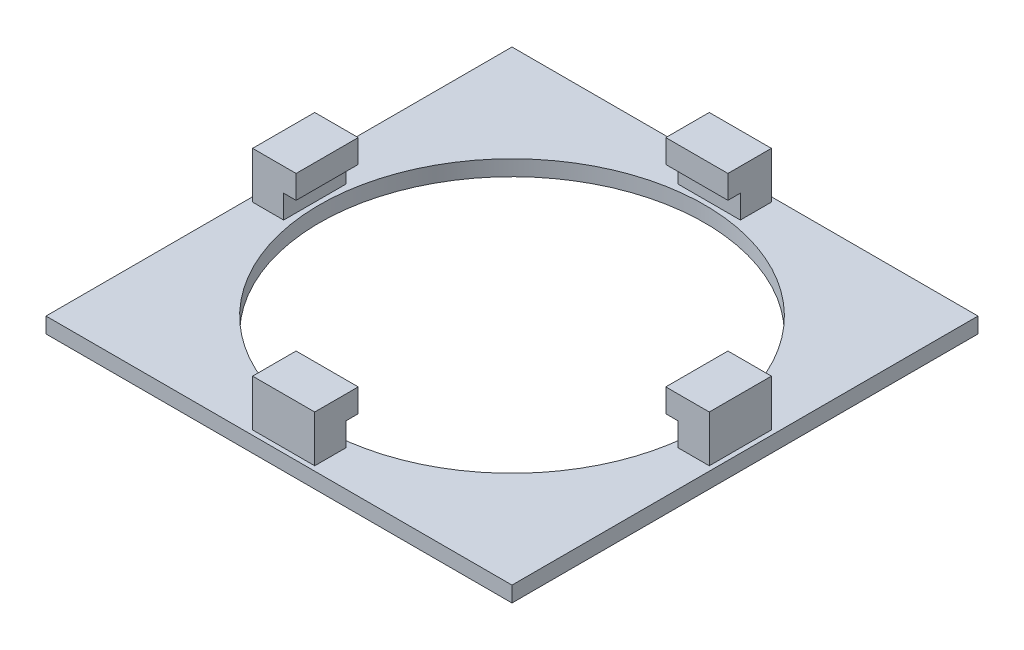
ISO-10303-21;
HEADER;
FILE_DESCRIPTION(('STEP AP214'),'2;1');
FILE_NAME('part.step','',(''),(''),'','','');
FILE_SCHEMA(('AUTOMOTIVE_DESIGN { 1 0 10303 214 1 1 1 1 }'));
ENDSEC;
DATA;
#1=APPLICATION_CONTEXT('core data for automotive mechanical design processes');
#2=APPLICATION_PROTOCOL_DEFINITION('international standard','automotive_design',2000,#1);
#3=PRODUCT_CONTEXT('',#1,'mechanical');
#4=PRODUCT('Part','Part','',(#3));
#5=PRODUCT_RELATED_PRODUCT_CATEGORY('part','',(#4));
#6=PRODUCT_DEFINITION_FORMATION('','',#4);
#7=PRODUCT_DEFINITION_CONTEXT('part definition',#1,'design');
#8=PRODUCT_DEFINITION('design','',#6,#7);
#9=PRODUCT_DEFINITION_SHAPE('','',#8);
#10=(LENGTH_UNIT() NAMED_UNIT(*) SI_UNIT(.MILLI.,.METRE.));
#11=(NAMED_UNIT(*) PLANE_ANGLE_UNIT() SI_UNIT($,.RADIAN.));
#12=(NAMED_UNIT(*) SI_UNIT($,.STERADIAN.) SOLID_ANGLE_UNIT());
#13=UNCERTAINTY_MEASURE_WITH_UNIT(LENGTH_MEASURE(1.E-05),#10,'distance_accuracy_value','');
#14=(GEOMETRIC_REPRESENTATION_CONTEXT(3) GLOBAL_UNCERTAINTY_ASSIGNED_CONTEXT((#13)) GLOBAL_UNIT_ASSIGNED_CONTEXT((#10,
#11,#12)) REPRESENTATION_CONTEXT('',''));
#15=CARTESIAN_POINT('',(0.,0.,0.));
#16=DIRECTION('',(0.,0.,1.));
#17=DIRECTION('',(1.,0.,0.));
#18=AXIS2_PLACEMENT_3D('',#15,#16,#17);
#19=CARTESIAN_POINT('',(1.99999999999875,3.,-12.7000000000017));
#20=DIRECTION('',(0.,0.,1.));
#21=DIRECTION('',(1.,0.,0.));
#22=AXIS2_PLACEMENT_3D('',#19,#20,#21);
#23=PLANE('',#22);
#24=DIRECTION('',(0.,-1.,0.));
#25=VECTOR('',#24,1.);
#26=CARTESIAN_POINT('',(1.99999999999875,3.,-12.7000000000017));
#27=LINE('',#26,#25);
#28=CARTESIAN_POINT('',(1.99999999999875,2.5,-12.7000000000017));
#29=VERTEX_POINT('',#28);
#30=CARTESIAN_POINT('',(1.99999999999875,1.,-12.7000000000017));
#31=VERTEX_POINT('',#30);
#32=EDGE_CURVE('E62',#29,#31,#27,.T.);
#33=ORIENTED_EDGE('',*,*,#32,.F.);
#34=DIRECTION('',(1.,0.,0.));
#35=VECTOR('',#34,1.);
#36=CARTESIAN_POINT('',(-2.00000000000125,2.5,-12.7000000000017));
#37=LINE('',#36,#35);
#38=CARTESIAN_POINT('',(-2.00000000000125,2.5,-12.7000000000017));
#39=VERTEX_POINT('',#38);
#40=EDGE_CURVE('E57',#39,#29,#37,.T.);
#41=ORIENTED_EDGE('',*,*,#40,.F.);
#42=DIRECTION('',(0.,-1.,0.));
#43=VECTOR('',#42,1.);
#44=CARTESIAN_POINT('',(-2.00000000000125,3.,-12.7000000000017));
#45=LINE('',#44,#43);
#46=CARTESIAN_POINT('',(-2.00000000000125,1.,-12.7000000000017));
#47=VERTEX_POINT('',#46);
#48=EDGE_CURVE('E238',#39,#47,#45,.T.);
#49=ORIENTED_EDGE('',*,*,#48,.T.);
#50=DIRECTION('',(-1.,0.,0.));
#51=VECTOR('',#50,1.);
#52=CARTESIAN_POINT('',(1.99999999999875,1.,-12.7000000000017));
#53=LINE('',#52,#51);
#54=EDGE_CURVE('E482',#31,#47,#53,.T.);
#55=ORIENTED_EDGE('',*,*,#54,.F.);
#56=EDGE_LOOP('',(#33,#41,#49,#55));
#57=FACE_BOUND('',#56,.T.);
#58=ADVANCED_FACE('F41',(#57),#23,.T.);
#59=CARTESIAN_POINT('',(-12.7,3.,-2.));
#60=DIRECTION('',(1.,0.,0.));
#61=DIRECTION('',(0.,0.,-1.));
#62=AXIS2_PLACEMENT_3D('',#59,#60,#61);
#63=PLANE('',#62);
#64=DIRECTION('',(0.,-1.,0.));
#65=VECTOR('',#64,1.);
#66=CARTESIAN_POINT('',(-12.7,3.,-2.));
#67=LINE('',#66,#65);
#68=CARTESIAN_POINT('',(-12.7,2.5,-2.));
#69=VERTEX_POINT('',#68);
#70=CARTESIAN_POINT('',(-12.7,1.,-2.));
#71=VERTEX_POINT('',#70);
#72=EDGE_CURVE('E393',#69,#71,#67,.T.);
#73=ORIENTED_EDGE('',*,*,#72,.F.);
#74=DIRECTION('',(0.,0.,-1.));
#75=VECTOR('',#74,1.);
#76=CARTESIAN_POINT('',(-12.7,2.5,2.));
#77=LINE('',#76,#75);
#78=CARTESIAN_POINT('',(-12.7,2.5,2.));
#79=VERTEX_POINT('',#78);
#80=EDGE_CURVE('E328',#79,#69,#77,.T.);
#81=ORIENTED_EDGE('',*,*,#80,.F.);
#82=DIRECTION('',(0.,-1.,0.));
#83=VECTOR('',#82,1.);
#84=CARTESIAN_POINT('',(-12.7,3.,2.));
#85=LINE('',#84,#83);
#86=CARTESIAN_POINT('',(-12.7,1.,2.));
#87=VERTEX_POINT('',#86);
#88=EDGE_CURVE('E397',#79,#87,#85,.T.);
#89=ORIENTED_EDGE('',*,*,#88,.T.);
#90=DIRECTION('',(0.,0.,1.));
#91=VECTOR('',#90,1.);
#92=CARTESIAN_POINT('',(-12.7,1.,-2.));
#93=LINE('',#92,#91);
#94=EDGE_CURVE('E412',#71,#87,#93,.T.);
#95=ORIENTED_EDGE('',*,*,#94,.F.);
#96=EDGE_LOOP('',(#73,#81,#89,#95));
#97=FACE_BOUND('',#96,.T.);
#98=ADVANCED_FACE('F568',(#97),#63,.T.);
#99=CARTESIAN_POINT('',(-1.99999999999828,3.,12.6999999999988));
#100=DIRECTION('',(0.,0.,-1.));
#101=DIRECTION('',(-1.,0.,0.));
#102=AXIS2_PLACEMENT_3D('',#99,#100,#101);
#103=PLANE('',#102);
#104=DIRECTION('',(0.,-1.,0.));
#105=VECTOR('',#104,1.);
#106=CARTESIAN_POINT('',(-1.99999999999828,3.,12.6999999999988));
#107=LINE('',#106,#105);
#108=CARTESIAN_POINT('',(-1.99999999999828,2.5,12.6999999999988));
#109=VERTEX_POINT('',#108);
#110=CARTESIAN_POINT('',(-1.99999999999828,1.,12.6999999999988));
#111=VERTEX_POINT('',#110);
#112=EDGE_CURVE('E426',#109,#111,#107,.T.);
#113=ORIENTED_EDGE('',*,*,#112,.F.);
#114=DIRECTION('',(-1.,0.,0.));
#115=VECTOR('',#114,1.);
#116=CARTESIAN_POINT('',(2.00000000000172,2.5,12.6999999999988));
#117=LINE('',#116,#115);
#118=CARTESIAN_POINT('',(2.00000000000172,2.5,12.6999999999988));
#119=VERTEX_POINT('',#118);
#120=EDGE_CURVE('E350',#119,#109,#117,.T.);
#121=ORIENTED_EDGE('',*,*,#120,.F.);
#122=DIRECTION('',(0.,-1.,0.));
#123=VECTOR('',#122,1.);
#124=CARTESIAN_POINT('',(2.00000000000172,3.,12.6999999999988));
#125=LINE('',#124,#123);
#126=CARTESIAN_POINT('',(2.00000000000172,1.,12.6999999999988));
#127=VERTEX_POINT('',#126);
#128=EDGE_CURVE('E423',#119,#127,#125,.T.);
#129=ORIENTED_EDGE('',*,*,#128,.T.);
#130=DIRECTION('',(1.,0.,0.));
#131=VECTOR('',#130,1.);
#132=CARTESIAN_POINT('',(-1.99999999999828,1.,12.6999999999988));
#133=LINE('',#132,#131);
#134=EDGE_CURVE('E436',#111,#127,#133,.T.);
#135=ORIENTED_EDGE('',*,*,#134,.F.);
#136=EDGE_LOOP('',(#113,#121,#129,#135));
#137=FACE_BOUND('',#136,.T.);
#138=ADVANCED_FACE('F573',(#137),#103,.T.);
#139=CARTESIAN_POINT('',(12.7,3.,-2.));
#140=DIRECTION('',(1.,0.,0.));
#141=DIRECTION('',(0.,0.,-1.));
#142=AXIS2_PLACEMENT_3D('',#139,#140,#141);
#143=PLANE('',#142);
#144=DIRECTION('',(0.,0.,1.));
#145=VECTOR('',#144,1.);
#146=CARTESIAN_POINT('',(12.7,2.5,-2.));
#147=LINE('',#146,#145);
#148=CARTESIAN_POINT('',(12.7,2.5,-2.));
#149=VERTEX_POINT('',#148);
#150=CARTESIAN_POINT('',(12.7,2.5,2.));
#151=VERTEX_POINT('',#150);
#152=EDGE_CURVE('E372',#149,#151,#147,.T.);
#153=ORIENTED_EDGE('',*,*,#152,.F.);
#154=DIRECTION('',(0.,-1.,0.));
#155=VECTOR('',#154,1.);
#156=CARTESIAN_POINT('',(12.7,3.,-2.));
#157=LINE('',#156,#155);
#158=CARTESIAN_POINT('',(12.7,1.,-2.));
#159=VERTEX_POINT('',#158);
#160=EDGE_CURVE('E448',#149,#159,#157,.T.);
#161=ORIENTED_EDGE('',*,*,#160,.T.);
#162=DIRECTION('',(0.,0.,1.));
#163=VECTOR('',#162,1.);
#164=CARTESIAN_POINT('',(12.7,1.,-2.));
#165=LINE('',#164,#163);
#166=CARTESIAN_POINT('',(12.7,1.,2.));
#167=VERTEX_POINT('',#166);
#168=EDGE_CURVE('E469',#159,#167,#165,.T.);
#169=ORIENTED_EDGE('',*,*,#168,.T.);
#170=DIRECTION('',(0.,-1.,0.));
#171=VECTOR('',#170,1.);
#172=CARTESIAN_POINT('',(12.7,3.,2.));
#173=LINE('',#172,#171);
#174=EDGE_CURVE('E451',#151,#167,#173,.T.);
#175=ORIENTED_EDGE('',*,*,#174,.F.);
#176=EDGE_LOOP('',(#153,#161,#169,#175));
#177=FACE_BOUND('',#176,.T.);
#178=ADVANCED_FACE('F590',(#177),#143,.F.);
#179=CARTESIAN_POINT('',(0.,1.,0.));
#180=DIRECTION('',(0.,-1.,0.));
#181=DIRECTION('',(0.,0.,-1.));
#182=AXIS2_PLACEMENT_3D('',#179,#180,#181);
#183=PLANE('',#182);
#184=DIRECTION('',(0.,0.,1.));
#185=VECTOR('',#184,1.);
#186=CARTESIAN_POINT('',(-14.7,1.,-2.));
#187=LINE('',#186,#185);
#188=CARTESIAN_POINT('',(-14.7,1.,-2.));
#189=VERTEX_POINT('',#188);
#190=CARTESIAN_POINT('',(-14.7,1.,2.));
#191=VERTEX_POINT('',#190);
#192=EDGE_CURVE('E396',#189,#191,#187,.T.);
#193=ORIENTED_EDGE('',*,*,#192,.F.);
#194=DIRECTION('',(1.,0.,0.));
#195=VECTOR('',#194,1.);
#196=CARTESIAN_POINT('',(-14.7,1.,-2.));
#197=LINE('',#196,#195);
#198=EDGE_CURVE('E416',#189,#71,#197,.T.);
#199=ORIENTED_EDGE('',*,*,#198,.T.);
#200=ORIENTED_EDGE('',*,*,#94,.T.);
#201=DIRECTION('',(1.,0.,0.));
#202=VECTOR('',#201,1.);
#203=CARTESIAN_POINT('',(-14.7,1.,2.));
#204=LINE('',#203,#202);
#205=EDGE_CURVE('E408',#191,#87,#204,.T.);
#206=ORIENTED_EDGE('',*,*,#205,.F.);
#207=EDGE_LOOP('',(#193,#199,#200,#206));
#208=FACE_BOUND('',#207,.T.);
#209=DIRECTION('',(-1.,0.,0.));
#210=VECTOR('',#209,1.);
#211=CARTESIAN_POINT('',(14.7,1.,-2.));
#212=LINE('',#211,#210);
#213=CARTESIAN_POINT('',(14.7,1.,-2.));
#214=VERTEX_POINT('',#213);
#215=EDGE_CURVE('E473',#214,#159,#212,.T.);
#216=ORIENTED_EDGE('',*,*,#215,.F.);
#217=DIRECTION('',(0.,0.,1.));
#218=VECTOR('',#217,1.);
#219=CARTESIAN_POINT('',(14.7,1.,-2.));
#220=LINE('',#219,#218);
#221=CARTESIAN_POINT('',(14.7,1.,2.));
#222=VERTEX_POINT('',#221);
#223=EDGE_CURVE('E461',#214,#222,#220,.T.);
#224=ORIENTED_EDGE('',*,*,#223,.T.);
#225=DIRECTION('',(-1.,0.,0.));
#226=VECTOR('',#225,1.);
#227=CARTESIAN_POINT('',(14.7,1.,2.));
#228=LINE('',#227,#226);
#229=EDGE_CURVE('E465',#222,#167,#228,.T.);
#230=ORIENTED_EDGE('',*,*,#229,.T.);
#231=ORIENTED_EDGE('',*,*,#168,.F.);
#232=EDGE_LOOP('',(#216,#224,#230,#231));
#233=FACE_BOUND('',#232,.T.);
#234=DIRECTION('',(0.,0.,-1.));
#235=VECTOR('',#234,1.);
#236=CARTESIAN_POINT('',(15.,1.,15.));
#237=LINE('',#236,#235);
#238=CARTESIAN_POINT('',(15.,1.,15.));
#239=VERTEX_POINT('',#238);
#240=CARTESIAN_POINT('',(15.,1.,-15.));
#241=VERTEX_POINT('',#240);
#242=EDGE_CURVE('E505',#239,#241,#237,.T.);
#243=ORIENTED_EDGE('',*,*,#242,.T.);
#244=DIRECTION('',(-1.,0.,0.));
#245=VECTOR('',#244,1.);
#246=CARTESIAN_POINT('',(-15.,1.,-15.));
#247=LINE('',#246,#245);
#248=CARTESIAN_POINT('',(-15.,1.,-15.));
#249=VERTEX_POINT('',#248);
#250=EDGE_CURVE('E509',#241,#249,#247,.T.);
#251=ORIENTED_EDGE('',*,*,#250,.T.);
#252=DIRECTION('',(0.,0.,1.));
#253=VECTOR('',#252,1.);
#254=CARTESIAN_POINT('',(-15.,1.,15.));
#255=LINE('',#254,#253);
#256=CARTESIAN_POINT('',(-15.,1.,15.));
#257=VERTEX_POINT('',#256);
#258=EDGE_CURVE('E513',#249,#257,#255,.T.);
#259=ORIENTED_EDGE('',*,*,#258,.T.);
#260=DIRECTION('',(1.,0.,0.));
#261=VECTOR('',#260,1.);
#262=CARTESIAN_POINT('',(-15.,1.,15.));
#263=LINE('',#262,#261);
#264=EDGE_CURVE('E516',#257,#239,#263,.T.);
#265=ORIENTED_EDGE('',*,*,#264,.T.);
#266=EDGE_LOOP('',(#243,#251,#259,#265));
#267=FACE_BOUND('',#266,.T.);
#268=CARTESIAN_POINT('',(0.,1.,0.));
#269=DIRECTION('',(0.,1.,0.));
#270=DIRECTION('',(0.,0.,1.));
#271=AXIS2_PLACEMENT_3D('',#268,#269,#270);
#272=CIRCLE('',#271,12.4);
#273=CARTESIAN_POINT('',(0.,1.,12.4));
#274=VERTEX_POINT('',#273);
#275=EDGE_CURVE('E237',#274,#274,#272,.T.);
#276=ORIENTED_EDGE('',*,*,#275,.F.);
#277=EDGE_LOOP('',(#276));
#278=FACE_BOUND('',#277,.T.);
#279=DIRECTION('',(-1.,0.,0.));
#280=VECTOR('',#279,1.);
#281=CARTESIAN_POINT('',(1.99999999999875,1.,-14.7000000000017));
#282=LINE('',#281,#280);
#283=CARTESIAN_POINT('',(1.99999999999875,1.,-14.7000000000017));
#284=VERTEX_POINT('',#283);
#285=CARTESIAN_POINT('',(-2.00000000000125,1.,-14.7000000000017));
#286=VERTEX_POINT('',#285);
#287=EDGE_CURVE('E232',#284,#286,#282,.T.);
#288=ORIENTED_EDGE('',*,*,#287,.F.);
#289=DIRECTION('',(0.,0.,1.));
#290=VECTOR('',#289,1.);
#291=CARTESIAN_POINT('',(1.99999999999875,1.,-14.7000000000017));
#292=LINE('',#291,#290);
#293=EDGE_CURVE('E486',#284,#31,#292,.T.);
#294=ORIENTED_EDGE('',*,*,#293,.T.);
#295=ORIENTED_EDGE('',*,*,#54,.T.);
#296=DIRECTION('',(0.,0.,1.));
#297=VECTOR('',#296,1.);
#298=CARTESIAN_POINT('',(-2.00000000000125,1.,-14.7000000000017));
#299=LINE('',#298,#297);
#300=EDGE_CURVE('E479',#286,#47,#299,.T.);
#301=ORIENTED_EDGE('',*,*,#300,.F.);
#302=EDGE_LOOP('',(#288,#294,#295,#301));
#303=FACE_BOUND('',#302,.T.);
#304=DIRECTION('',(1.,0.,0.));
#305=VECTOR('',#304,1.);
#306=CARTESIAN_POINT('',(-1.99999999999828,1.,14.6999999999988));
#307=LINE('',#306,#305);
#308=CARTESIAN_POINT('',(-1.99999999999828,1.,14.6999999999988));
#309=VERTEX_POINT('',#308);
#310=CARTESIAN_POINT('',(2.00000000000172,1.,14.6999999999988));
#311=VERTEX_POINT('',#310);
#312=EDGE_CURVE('E444',#309,#311,#307,.T.);
#313=ORIENTED_EDGE('',*,*,#312,.F.);
#314=DIRECTION('',(0.,0.,-1.));
#315=VECTOR('',#314,1.);
#316=CARTESIAN_POINT('',(-1.99999999999828,1.,14.6999999999988));
#317=LINE('',#316,#315);
#318=EDGE_CURVE('E432',#309,#111,#317,.T.);
#319=ORIENTED_EDGE('',*,*,#318,.T.);
#320=ORIENTED_EDGE('',*,*,#134,.T.);
#321=DIRECTION('',(0.,0.,-1.));
#322=VECTOR('',#321,1.);
#323=CARTESIAN_POINT('',(2.00000000000172,1.,14.6999999999988));
#324=LINE('',#323,#322);
#325=EDGE_CURVE('E440',#311,#127,#324,.T.);
#326=ORIENTED_EDGE('',*,*,#325,.F.);
#327=EDGE_LOOP('',(#313,#319,#320,#326));
#328=FACE_BOUND('',#327,.T.);
#329=ADVANCED_FACE('F558',(#208,#233,#267,#278,#303,#328),#183,.F.);
#330=CARTESIAN_POINT('',(15.,1.,15.));
#331=DIRECTION('',(-1.,0.,0.));
#332=DIRECTION('',(0.,0.,1.));
#333=AXIS2_PLACEMENT_3D('',#330,#331,#332);
#334=PLANE('',#333);
#335=DIRECTION('',(0.,0.,-1.));
#336=VECTOR('',#335,1.);
#337=CARTESIAN_POINT('',(15.,0.,15.));
#338=LINE('',#337,#336);
#339=CARTESIAN_POINT('',(15.,0.,15.));
#340=VERTEX_POINT('',#339);
#341=CARTESIAN_POINT('',(15.,0.,-15.));
#342=VERTEX_POINT('',#341);
#343=EDGE_CURVE('E501',#340,#342,#338,.T.);
#344=ORIENTED_EDGE('',*,*,#343,.T.);
#345=DIRECTION('',(0.,-1.,0.));
#346=VECTOR('',#345,1.);
#347=CARTESIAN_POINT('',(15.,1.,-15.));
#348=LINE('',#347,#346);
#349=EDGE_CURVE('E11',#241,#342,#348,.T.);
#350=ORIENTED_EDGE('',*,*,#349,.F.);
#351=ORIENTED_EDGE('',*,*,#242,.F.);
#352=DIRECTION('',(0.,-1.,0.));
#353=VECTOR('',#352,1.);
#354=CARTESIAN_POINT('',(15.,1.,15.));
#355=LINE('',#354,#353);
#356=EDGE_CURVE('E519',#239,#340,#355,.T.);
#357=ORIENTED_EDGE('',*,*,#356,.T.);
#358=EDGE_LOOP('',(#344,#350,#351,#357));
#359=FACE_BOUND('',#358,.T.);
#360=ADVANCED_FACE('F43',(#359),#334,.F.);
#361=CARTESIAN_POINT('',(-15.,1.,-15.));
#362=DIRECTION('',(0.,0.,1.));
#363=DIRECTION('',(1.,0.,0.));
#364=AXIS2_PLACEMENT_3D('',#361,#362,#363);
#365=PLANE('',#364);
#366=DIRECTION('',(-1.,0.,0.));
#367=VECTOR('',#366,1.);
#368=CARTESIAN_POINT('',(-15.,0.,-15.));
#369=LINE('',#368,#367);
#370=CARTESIAN_POINT('',(-15.,0.,-15.));
#371=VERTEX_POINT('',#370);
#372=EDGE_CURVE('E523',#342,#371,#369,.T.);
#373=ORIENTED_EDGE('',*,*,#372,.T.);
#374=DIRECTION('',(0.,-1.,0.));
#375=VECTOR('',#374,1.);
#376=CARTESIAN_POINT('',(-15.,1.,-15.));
#377=LINE('',#376,#375);
#378=EDGE_CURVE('E50',#249,#371,#377,.T.);
#379=ORIENTED_EDGE('',*,*,#378,.F.);
#380=ORIENTED_EDGE('',*,*,#250,.F.);
#381=ORIENTED_EDGE('',*,*,#349,.T.);
#382=EDGE_LOOP('',(#373,#379,#380,#381));
#383=FACE_BOUND('',#382,.T.);
#384=ADVANCED_FACE('F560',(#383),#365,.F.);
#385=CARTESIAN_POINT('',(-15.,1.,15.));
#386=DIRECTION('',(1.,0.,0.));
#387=DIRECTION('',(0.,0.,-1.));
#388=AXIS2_PLACEMENT_3D('',#385,#386,#387);
#389=PLANE('',#388);
#390=DIRECTION('',(0.,0.,1.));
#391=VECTOR('',#390,1.);
#392=CARTESIAN_POINT('',(-15.,0.,15.));
#393=LINE('',#392,#391);
#394=CARTESIAN_POINT('',(-15.,0.,15.));
#395=VERTEX_POINT('',#394);
#396=EDGE_CURVE('E526',#371,#395,#393,.T.);
#397=ORIENTED_EDGE('',*,*,#396,.T.);
#398=DIRECTION('',(0.,-1.,0.));
#399=VECTOR('',#398,1.);
#400=CARTESIAN_POINT('',(-15.,1.,15.));
#401=LINE('',#400,#399);
#402=EDGE_CURVE('E534',#257,#395,#401,.T.);
#403=ORIENTED_EDGE('',*,*,#402,.F.);
#404=ORIENTED_EDGE('',*,*,#258,.F.);
#405=ORIENTED_EDGE('',*,*,#378,.T.);
#406=EDGE_LOOP('',(#397,#403,#404,#405));
#407=FACE_BOUND('',#406,.T.);
#408=ADVANCED_FACE('F543',(#407),#389,.F.);
#409=CARTESIAN_POINT('',(-15.,1.,15.));
#410=DIRECTION('',(0.,0.,-1.));
#411=DIRECTION('',(-1.,0.,0.));
#412=AXIS2_PLACEMENT_3D('',#409,#410,#411);
#413=PLANE('',#412);
#414=DIRECTION('',(1.,0.,0.));
#415=VECTOR('',#414,1.);
#416=CARTESIAN_POINT('',(-15.,0.,15.));
#417=LINE('',#416,#415);
#418=EDGE_CURVE('E510',#395,#340,#417,.T.);
#419=ORIENTED_EDGE('',*,*,#418,.T.);
#420=ORIENTED_EDGE('',*,*,#356,.F.);
#421=ORIENTED_EDGE('',*,*,#264,.F.);
#422=ORIENTED_EDGE('',*,*,#402,.T.);
#423=EDGE_LOOP('',(#419,#420,#421,#422));
#424=FACE_BOUND('',#423,.T.);
#425=ADVANCED_FACE('F552',(#424),#413,.F.);
#426=CARTESIAN_POINT('',(0.,0.,0.));
#427=DIRECTION('',(0.,-1.,0.));
#428=DIRECTION('',(0.,0.,-1.));
#429=AXIS2_PLACEMENT_3D('',#426,#427,#428);
#430=PLANE('',#429);
#431=CARTESIAN_POINT('',(0.,0.,0.));
#432=DIRECTION('',(0.,1.,0.));
#433=DIRECTION('',(0.,0.,1.));
#434=AXIS2_PLACEMENT_3D('',#431,#432,#433);
#435=CIRCLE('',#434,12.4);
#436=CARTESIAN_POINT('',(0.,0.,12.4));
#437=VERTEX_POINT('',#436);
#438=EDGE_CURVE('E497',#437,#437,#435,.T.);
#439=ORIENTED_EDGE('',*,*,#438,.T.);
#440=EDGE_LOOP('',(#439));
#441=FACE_BOUND('',#440,.T.);
#442=ORIENTED_EDGE('',*,*,#343,.F.);
#443=ORIENTED_EDGE('',*,*,#418,.F.);
#444=ORIENTED_EDGE('',*,*,#396,.F.);
#445=ORIENTED_EDGE('',*,*,#372,.F.);
#446=EDGE_LOOP('',(#442,#443,#444,#445));
#447=FACE_BOUND('',#446,.T.);
#448=ADVANCED_FACE('F549',(#441,#447),#430,.T.);
#449=CARTESIAN_POINT('',(0.,0.,0.));
#450=DIRECTION('',(0.,1.,0.));
#451=DIRECTION('',(0.,0.,1.));
#452=AXIS2_PLACEMENT_3D('',#449,#450,#451);
#453=CYLINDRICAL_SURFACE('',#452,12.4);
#454=ORIENTED_EDGE('',*,*,#438,.F.);
#455=EDGE_LOOP('',(#454));
#456=FACE_BOUND('',#455,.T.);
#457=ORIENTED_EDGE('',*,*,#275,.T.);
#458=EDGE_LOOP('',(#457));
#459=FACE_BOUND('',#458,.T.);
#460=ADVANCED_FACE('F584',(#456,#459),#453,.F.);
#461=CARTESIAN_POINT('',(1.99999999999875,3.,-14.7000000000017));
#462=DIRECTION('',(0.,0.,1.));
#463=DIRECTION('',(1.,0.,0.));
#464=AXIS2_PLACEMENT_3D('',#461,#462,#463);
#465=PLANE('',#464);
#466=ORIENTED_EDGE('',*,*,#287,.T.);
#467=DIRECTION('',(0.,-1.,0.));
#468=VECTOR('',#467,1.);
#469=CARTESIAN_POINT('',(-2.00000000000125,3.,-14.7000000000017));
#470=LINE('',#469,#468);
#471=CARTESIAN_POINT('',(-1.99999999999829,4.,-14.6999999999988));
#472=VERTEX_POINT('',#471);
#473=EDGE_CURVE('E225',#472,#286,#470,.T.);
#474=ORIENTED_EDGE('',*,*,#473,.F.);
#475=DIRECTION('',(1.,0.,0.));
#476=VECTOR('',#475,1.);
#477=CARTESIAN_POINT('',(0.,4.,-14.6999999999988));
#478=LINE('',#477,#476);
#479=CARTESIAN_POINT('',(2.00000000000171,4.,-14.6999999999988));
#480=VERTEX_POINT('',#479);
#481=EDGE_CURVE('E229',#472,#480,#478,.T.);
#482=ORIENTED_EDGE('',*,*,#481,.T.);
#483=DIRECTION('',(0.,-1.,0.));
#484=VECTOR('',#483,1.);
#485=CARTESIAN_POINT('',(1.99999999999875,3.,-14.7000000000017));
#486=LINE('',#485,#484);
#487=EDGE_CURVE('E490',#480,#284,#486,.T.);
#488=ORIENTED_EDGE('',*,*,#487,.T.);
#489=EDGE_LOOP('',(#466,#474,#482,#488));
#490=FACE_BOUND('',#489,.T.);
#491=ADVANCED_FACE('F227',(#490),#465,.F.);
#492=CARTESIAN_POINT('',(-2.00000000000125,3.,-14.7000000000017));
#493=DIRECTION('',(1.,0.,0.));
#494=DIRECTION('',(0.,0.,-1.));
#495=AXIS2_PLACEMENT_3D('',#492,#493,#494);
#496=PLANE('',#495);
#497=ORIENTED_EDGE('',*,*,#300,.T.);
#498=ORIENTED_EDGE('',*,*,#48,.F.);
#499=DIRECTION('',(0.,0.,-1.));
#500=VECTOR('',#499,1.);
#501=CARTESIAN_POINT('',(-2.00000000000125,2.5,-11.9000000000017));
#502=LINE('',#501,#500);
#503=CARTESIAN_POINT('',(-2.00000000000125,2.5,-11.9000000000017));
#504=VERTEX_POINT('',#503);
#505=EDGE_CURVE('E324',#504,#39,#502,.T.);
#506=ORIENTED_EDGE('',*,*,#505,.F.);
#507=DIRECTION('',(0.,-1.,0.));
#508=VECTOR('',#507,1.);
#509=CARTESIAN_POINT('',(-2.00000000000125,3.,-11.9000000000017));
#510=LINE('',#509,#508);
#511=CARTESIAN_POINT('',(-1.99999999999829,4.,-11.8999999999987));
#512=VERTEX_POINT('',#511);
#513=EDGE_CURVE('E245',#512,#504,#510,.T.);
#514=ORIENTED_EDGE('',*,*,#513,.F.);
#515=DIRECTION('',(0.,0.,1.));
#516=VECTOR('',#515,1.);
#517=CARTESIAN_POINT('',(-1.99999999999829,4.,0.));
#518=LINE('',#517,#516);
#519=EDGE_CURVE('E241',#472,#512,#518,.T.);
#520=ORIENTED_EDGE('',*,*,#519,.F.);
#521=ORIENTED_EDGE('',*,*,#473,.T.);
#522=EDGE_LOOP('',(#497,#498,#506,#514,#520,#521));
#523=FACE_BOUND('',#522,.T.);
#524=ADVANCED_FACE('F242',(#523),#496,.F.);
#525=CARTESIAN_POINT('',(1.99999999999875,3.,-14.7000000000017));
#526=DIRECTION('',(1.,0.,0.));
#527=DIRECTION('',(0.,0.,-1.));
#528=AXIS2_PLACEMENT_3D('',#525,#526,#527);
#529=PLANE('',#528);
#530=ORIENTED_EDGE('',*,*,#293,.F.);
#531=ORIENTED_EDGE('',*,*,#487,.F.);
#532=DIRECTION('',(0.,0.,1.));
#533=VECTOR('',#532,1.);
#534=CARTESIAN_POINT('',(2.00000000000171,4.,0.));
#535=LINE('',#534,#533);
#536=CARTESIAN_POINT('',(2.00000000000171,4.,-11.8999999999987));
#537=VERTEX_POINT('',#536);
#538=EDGE_CURVE('E254',#480,#537,#535,.T.);
#539=ORIENTED_EDGE('',*,*,#538,.T.);
#540=DIRECTION('',(0.,1.,0.));
#541=VECTOR('',#540,1.);
#542=CARTESIAN_POINT('',(1.99999999999875,3.,-11.9000000000017));
#543=LINE('',#542,#541);
#544=CARTESIAN_POINT('',(1.99999999999875,2.5,-11.9000000000017));
#545=VERTEX_POINT('',#544);
#546=EDGE_CURVE('E315',#545,#537,#543,.T.);
#547=ORIENTED_EDGE('',*,*,#546,.F.);
#548=DIRECTION('',(0.,0.,-1.));
#549=VECTOR('',#548,1.);
#550=CARTESIAN_POINT('',(1.99999999999875,2.5,-11.9000000000017));
#551=LINE('',#550,#549);
#552=EDGE_CURVE('E318',#545,#29,#551,.T.);
#553=ORIENTED_EDGE('',*,*,#552,.T.);
#554=ORIENTED_EDGE('',*,*,#32,.T.);
#555=EDGE_LOOP('',(#530,#531,#539,#547,#553,#554));
#556=FACE_BOUND('',#555,.T.);
#557=ADVANCED_FACE('F578',(#556),#529,.T.);
#558=CARTESIAN_POINT('',(14.7,3.,-2.));
#559=DIRECTION('',(0.,0.,1.));
#560=DIRECTION('',(1.,0.,0.));
#561=AXIS2_PLACEMENT_3D('',#558,#559,#560);
#562=PLANE('',#561);
#563=ORIENTED_EDGE('',*,*,#215,.T.);
#564=ORIENTED_EDGE('',*,*,#160,.F.);
#565=DIRECTION('',(1.,0.,0.));
#566=VECTOR('',#565,1.);
#567=CARTESIAN_POINT('',(11.9,2.5,-2.));
#568=LINE('',#567,#566);
#569=CARTESIAN_POINT('',(11.9,2.5,-2.));
#570=VERTEX_POINT('',#569);
#571=EDGE_CURVE('E389',#570,#149,#568,.T.);
#572=ORIENTED_EDGE('',*,*,#571,.F.);
#573=DIRECTION('',(0.,-1.,0.));
#574=VECTOR('',#573,1.);
#575=CARTESIAN_POINT('',(11.9,3.,-2.));
#576=LINE('',#575,#574);
#577=CARTESIAN_POINT('',(11.9,4.,-2.));
#578=VERTEX_POINT('',#577);
#579=EDGE_CURVE('E373',#578,#570,#576,.T.);
#580=ORIENTED_EDGE('',*,*,#579,.F.);
#581=DIRECTION('',(-1.,0.,0.));
#582=VECTOR('',#581,1.);
#583=CARTESIAN_POINT('',(0.,4.,-2.));
#584=LINE('',#583,#582);
#585=CARTESIAN_POINT('',(14.7,4.,-2.));
#586=VERTEX_POINT('',#585);
#587=EDGE_CURVE('E270',#586,#578,#584,.T.);
#588=ORIENTED_EDGE('',*,*,#587,.F.);
#589=DIRECTION('',(0.,-1.,0.));
#590=VECTOR('',#589,1.);
#591=CARTESIAN_POINT('',(14.7,3.,-2.));
#592=LINE('',#591,#590);
#593=EDGE_CURVE('E458',#586,#214,#592,.T.);
#594=ORIENTED_EDGE('',*,*,#593,.T.);
#595=EDGE_LOOP('',(#563,#564,#572,#580,#588,#594));
#596=FACE_BOUND('',#595,.T.);
#597=ADVANCED_FACE('F663',(#596),#562,.F.);
#598=CARTESIAN_POINT('',(14.7,3.,2.));
#599=DIRECTION('',(0.,0.,1.));
#600=DIRECTION('',(1.,0.,0.));
#601=AXIS2_PLACEMENT_3D('',#598,#599,#600);
#602=PLANE('',#601);
#603=ORIENTED_EDGE('',*,*,#229,.F.);
#604=DIRECTION('',(0.,-1.,0.));
#605=VECTOR('',#604,1.);
#606=CARTESIAN_POINT('',(14.7,3.,2.));
#607=LINE('',#606,#605);
#608=CARTESIAN_POINT('',(14.7,4.,2.));
#609=VERTEX_POINT('',#608);
#610=EDGE_CURVE('E454',#609,#222,#607,.T.);
#611=ORIENTED_EDGE('',*,*,#610,.F.);
#612=DIRECTION('',(-1.,0.,0.));
#613=VECTOR('',#612,1.);
#614=CARTESIAN_POINT('',(0.,4.,2.));
#615=LINE('',#614,#613);
#616=CARTESIAN_POINT('',(11.9,4.,2.));
#617=VERTEX_POINT('',#616);
#618=EDGE_CURVE('E262',#609,#617,#615,.T.);
#619=ORIENTED_EDGE('',*,*,#618,.T.);
#620=DIRECTION('',(0.,1.,0.));
#621=VECTOR('',#620,1.);
#622=CARTESIAN_POINT('',(11.9,3.,2.));
#623=LINE('',#622,#621);
#624=CARTESIAN_POINT('',(11.9,2.5,2.));
#625=VERTEX_POINT('',#624);
#626=EDGE_CURVE('E380',#625,#617,#623,.T.);
#627=ORIENTED_EDGE('',*,*,#626,.F.);
#628=DIRECTION('',(1.,0.,0.));
#629=VECTOR('',#628,1.);
#630=CARTESIAN_POINT('',(11.9,2.5,2.));
#631=LINE('',#630,#629);
#632=EDGE_CURVE('E383',#625,#151,#631,.T.);
#633=ORIENTED_EDGE('',*,*,#632,.T.);
#634=ORIENTED_EDGE('',*,*,#174,.T.);
#635=EDGE_LOOP('',(#603,#611,#619,#627,#633,#634));
#636=FACE_BOUND('',#635,.T.);
#637=ADVANCED_FACE('F670',(#636),#602,.T.);
#638=CARTESIAN_POINT('',(14.7,3.,-2.));
#639=DIRECTION('',(1.,0.,0.));
#640=DIRECTION('',(0.,0.,-1.));
#641=AXIS2_PLACEMENT_3D('',#638,#639,#640);
#642=PLANE('',#641);
#643=ORIENTED_EDGE('',*,*,#223,.F.);
#644=ORIENTED_EDGE('',*,*,#593,.F.);
#645=DIRECTION('',(0.,0.,-1.));
#646=VECTOR('',#645,1.);
#647=CARTESIAN_POINT('',(14.7,4.,0.));
#648=LINE('',#647,#646);
#649=EDGE_CURVE('E266',#609,#586,#648,.T.);
#650=ORIENTED_EDGE('',*,*,#649,.F.);
#651=ORIENTED_EDGE('',*,*,#610,.T.);
#652=EDGE_LOOP('',(#643,#644,#650,#651));
#653=FACE_BOUND('',#652,.T.);
#654=ADVANCED_FACE('F678',(#653),#642,.T.);
#655=CARTESIAN_POINT('',(-1.99999999999828,3.,14.6999999999988));
#656=DIRECTION('',(0.,0.,-1.));
#657=DIRECTION('',(-1.,0.,0.));
#658=AXIS2_PLACEMENT_3D('',#655,#656,#657);
#659=PLANE('',#658);
#660=ORIENTED_EDGE('',*,*,#312,.T.);
#661=DIRECTION('',(0.,-1.,0.));
#662=VECTOR('',#661,1.);
#663=CARTESIAN_POINT('',(2.00000000000172,3.,14.6999999999988));
#664=LINE('',#663,#662);
#665=CARTESIAN_POINT('',(2.00000000000172,4.,14.6999999999988));
#666=VERTEX_POINT('',#665);
#667=EDGE_CURVE('E420',#666,#311,#664,.T.);
#668=ORIENTED_EDGE('',*,*,#667,.F.);
#669=DIRECTION('',(1.,0.,0.));
#670=VECTOR('',#669,1.);
#671=CARTESIAN_POINT('',(0.,4.,14.6999999999988));
#672=LINE('',#671,#670);
#673=CARTESIAN_POINT('',(-1.99999999999828,4.,14.6999999999988));
#674=VERTEX_POINT('',#673);
#675=EDGE_CURVE('E278',#674,#666,#672,.T.);
#676=ORIENTED_EDGE('',*,*,#675,.F.);
#677=DIRECTION('',(0.,-1.,0.));
#678=VECTOR('',#677,1.);
#679=CARTESIAN_POINT('',(-1.99999999999828,3.,14.6999999999988));
#680=LINE('',#679,#678);
#681=EDGE_CURVE('E429',#674,#309,#680,.T.);
#682=ORIENTED_EDGE('',*,*,#681,.T.);
#683=EDGE_LOOP('',(#660,#668,#676,#682));
#684=FACE_BOUND('',#683,.T.);
#685=ADVANCED_FACE('F686',(#684),#659,.F.);
#686=CARTESIAN_POINT('',(2.00000000000172,3.,14.6999999999988));
#687=DIRECTION('',(-1.,0.,0.));
#688=DIRECTION('',(0.,0.,1.));
#689=AXIS2_PLACEMENT_3D('',#686,#687,#688);
#690=PLANE('',#689);
#691=ORIENTED_EDGE('',*,*,#325,.T.);
#692=ORIENTED_EDGE('',*,*,#128,.F.);
#693=DIRECTION('',(0.,0.,1.));
#694=VECTOR('',#693,1.);
#695=CARTESIAN_POINT('',(2.00000000000172,2.5,11.8999999999987));
#696=LINE('',#695,#694);
#697=CARTESIAN_POINT('',(2.00000000000172,2.5,11.8999999999987));
#698=VERTEX_POINT('',#697);
#699=EDGE_CURVE('E368',#698,#119,#696,.T.);
#700=ORIENTED_EDGE('',*,*,#699,.F.);
#701=DIRECTION('',(0.,-1.,0.));
#702=VECTOR('',#701,1.);
#703=CARTESIAN_POINT('',(2.00000000000172,3.,11.8999999999987));
#704=LINE('',#703,#702);
#705=CARTESIAN_POINT('',(2.00000000000172,4.,11.8999999999987));
#706=VERTEX_POINT('',#705);
#707=EDGE_CURVE('E351',#706,#698,#704,.T.);
#708=ORIENTED_EDGE('',*,*,#707,.F.);
#709=DIRECTION('',(0.,0.,-1.));
#710=VECTOR('',#709,1.);
#711=CARTESIAN_POINT('',(2.00000000000172,4.,0.));
#712=LINE('',#711,#710);
#713=EDGE_CURVE('E282',#666,#706,#712,.T.);
#714=ORIENTED_EDGE('',*,*,#713,.F.);
#715=ORIENTED_EDGE('',*,*,#667,.T.);
#716=EDGE_LOOP('',(#691,#692,#700,#708,#714,#715));
#717=FACE_BOUND('',#716,.T.);
#718=ADVANCED_FACE('F693',(#717),#690,.F.);
#719=CARTESIAN_POINT('',(-1.99999999999828,3.,14.6999999999988));
#720=DIRECTION('',(-1.,0.,0.));
#721=DIRECTION('',(0.,0.,1.));
#722=AXIS2_PLACEMENT_3D('',#719,#720,#721);
#723=PLANE('',#722);
#724=ORIENTED_EDGE('',*,*,#318,.F.);
#725=ORIENTED_EDGE('',*,*,#681,.F.);
#726=DIRECTION('',(0.,0.,-1.));
#727=VECTOR('',#726,1.);
#728=CARTESIAN_POINT('',(-1.99999999999828,4.,0.));
#729=LINE('',#728,#727);
#730=CARTESIAN_POINT('',(-1.99999999999828,4.,11.8999999999987));
#731=VERTEX_POINT('',#730);
#732=EDGE_CURVE('E290',#674,#731,#729,.T.);
#733=ORIENTED_EDGE('',*,*,#732,.T.);
#734=DIRECTION('',(0.,1.,0.));
#735=VECTOR('',#734,1.);
#736=CARTESIAN_POINT('',(-1.99999999999828,3.,11.8999999999987));
#737=LINE('',#736,#735);
#738=CARTESIAN_POINT('',(-1.99999999999828,2.5,11.8999999999987));
#739=VERTEX_POINT('',#738);
#740=EDGE_CURVE('E358',#739,#731,#737,.T.);
#741=ORIENTED_EDGE('',*,*,#740,.F.);
#742=DIRECTION('',(0.,0.,1.));
#743=VECTOR('',#742,1.);
#744=CARTESIAN_POINT('',(-1.99999999999828,2.5,11.8999999999987));
#745=LINE('',#744,#743);
#746=EDGE_CURVE('E361',#739,#109,#745,.T.);
#747=ORIENTED_EDGE('',*,*,#746,.T.);
#748=ORIENTED_EDGE('',*,*,#112,.T.);
#749=EDGE_LOOP('',(#724,#725,#733,#741,#747,#748));
#750=FACE_BOUND('',#749,.T.);
#751=ADVANCED_FACE('F701',(#750),#723,.T.);
#752=CARTESIAN_POINT('',(-14.7,3.,-2.));
#753=DIRECTION('',(0.,0.,-1.));
#754=DIRECTION('',(-1.,0.,0.));
#755=AXIS2_PLACEMENT_3D('',#752,#753,#754);
#756=PLANE('',#755);
#757=ORIENTED_EDGE('',*,*,#198,.F.);
#758=DIRECTION('',(0.,-1.,0.));
#759=VECTOR('',#758,1.);
#760=CARTESIAN_POINT('',(-14.7,3.,-2.));
#761=LINE('',#760,#759);
#762=CARTESIAN_POINT('',(-14.7,4.,-2.));
#763=VERTEX_POINT('',#762);
#764=EDGE_CURVE('E392',#763,#189,#761,.T.);
#765=ORIENTED_EDGE('',*,*,#764,.F.);
#766=DIRECTION('',(-1.,0.,0.));
#767=VECTOR('',#766,1.);
#768=CARTESIAN_POINT('',(0.,4.,-2.));
#769=LINE('',#768,#767);
#770=CARTESIAN_POINT('',(-11.9,4.,-2.));
#771=VERTEX_POINT('',#770);
#772=EDGE_CURVE('E298',#771,#763,#769,.T.);
#773=ORIENTED_EDGE('',*,*,#772,.F.);
#774=DIRECTION('',(0.,1.,0.));
#775=VECTOR('',#774,1.);
#776=CARTESIAN_POINT('',(-11.9,3.,-2.));
#777=LINE('',#776,#775);
#778=CARTESIAN_POINT('',(-11.9,2.5,-2.));
#779=VERTEX_POINT('',#778);
#780=EDGE_CURVE('E336',#779,#771,#777,.T.);
#781=ORIENTED_EDGE('',*,*,#780,.F.);
#782=DIRECTION('',(-1.,0.,0.));
#783=VECTOR('',#782,1.);
#784=CARTESIAN_POINT('',(-11.9,2.5,-2.));
#785=LINE('',#784,#783);
#786=EDGE_CURVE('E339',#779,#69,#785,.T.);
#787=ORIENTED_EDGE('',*,*,#786,.T.);
#788=ORIENTED_EDGE('',*,*,#72,.T.);
#789=EDGE_LOOP('',(#757,#765,#773,#781,#787,#788));
#790=FACE_BOUND('',#789,.T.);
#791=ADVANCED_FACE('F709',(#790),#756,.T.);
#792=CARTESIAN_POINT('',(-14.7,3.,-2.));
#793=DIRECTION('',(1.,0.,0.));
#794=DIRECTION('',(0.,0.,-1.));
#795=AXIS2_PLACEMENT_3D('',#792,#793,#794);
#796=PLANE('',#795);
#797=ORIENTED_EDGE('',*,*,#192,.T.);
#798=DIRECTION('',(0.,-1.,0.));
#799=VECTOR('',#798,1.);
#800=CARTESIAN_POINT('',(-14.7,3.,2.));
#801=LINE('',#800,#799);
#802=CARTESIAN_POINT('',(-14.7,4.,2.));
#803=VERTEX_POINT('',#802);
#804=EDGE_CURVE('E400',#803,#191,#801,.T.);
#805=ORIENTED_EDGE('',*,*,#804,.F.);
#806=DIRECTION('',(0.,0.,1.));
#807=VECTOR('',#806,1.);
#808=CARTESIAN_POINT('',(-14.7,4.,0.));
#809=LINE('',#808,#807);
#810=EDGE_CURVE('E302',#763,#803,#809,.T.);
#811=ORIENTED_EDGE('',*,*,#810,.F.);
#812=ORIENTED_EDGE('',*,*,#764,.T.);
#813=EDGE_LOOP('',(#797,#805,#811,#812));
#814=FACE_BOUND('',#813,.T.);
#815=ADVANCED_FACE('F717',(#814),#796,.F.);
#816=CARTESIAN_POINT('',(-14.7,3.,2.));
#817=DIRECTION('',(0.,0.,-1.));
#818=DIRECTION('',(-1.,0.,0.));
#819=AXIS2_PLACEMENT_3D('',#816,#817,#818);
#820=PLANE('',#819);
#821=ORIENTED_EDGE('',*,*,#205,.T.);
#822=ORIENTED_EDGE('',*,*,#88,.F.);
#823=DIRECTION('',(-1.,0.,0.));
#824=VECTOR('',#823,1.);
#825=CARTESIAN_POINT('',(-11.9,2.5,2.));
#826=LINE('',#825,#824);
#827=CARTESIAN_POINT('',(-11.9,2.5,2.));
#828=VERTEX_POINT('',#827);
#829=EDGE_CURVE('E346',#828,#79,#826,.T.);
#830=ORIENTED_EDGE('',*,*,#829,.F.);
#831=DIRECTION('',(0.,-1.,0.));
#832=VECTOR('',#831,1.);
#833=CARTESIAN_POINT('',(-11.9,3.,2.));
#834=LINE('',#833,#832);
#835=CARTESIAN_POINT('',(-11.9,4.,2.));
#836=VERTEX_POINT('',#835);
#837=EDGE_CURVE('E329',#836,#828,#834,.T.);
#838=ORIENTED_EDGE('',*,*,#837,.F.);
#839=DIRECTION('',(1.,0.,0.));
#840=VECTOR('',#839,1.);
#841=CARTESIAN_POINT('',(0.,4.,2.));
#842=LINE('',#841,#840);
#843=EDGE_CURVE('E306',#803,#836,#842,.T.);
#844=ORIENTED_EDGE('',*,*,#843,.F.);
#845=ORIENTED_EDGE('',*,*,#804,.T.);
#846=EDGE_LOOP('',(#821,#822,#830,#838,#844,#845));
#847=FACE_BOUND('',#846,.T.);
#848=ADVANCED_FACE('F617',(#847),#820,.F.);
#849=CARTESIAN_POINT('',(11.9,2.5,-2.));
#850=DIRECTION('',(0.,1.,0.));
#851=DIRECTION('',(0.,0.,1.));
#852=AXIS2_PLACEMENT_3D('',#849,#850,#851);
#853=PLANE('',#852);
#854=ORIENTED_EDGE('',*,*,#152,.T.);
#855=ORIENTED_EDGE('',*,*,#632,.F.);
#856=DIRECTION('',(0.,0.,1.));
#857=VECTOR('',#856,1.);
#858=CARTESIAN_POINT('',(11.9,2.5,-2.));
#859=LINE('',#858,#857);
#860=EDGE_CURVE('E377',#570,#625,#859,.T.);
#861=ORIENTED_EDGE('',*,*,#860,.F.);
#862=ORIENTED_EDGE('',*,*,#571,.T.);
#863=EDGE_LOOP('',(#854,#855,#861,#862));
#864=FACE_BOUND('',#863,.T.);
#865=ADVANCED_FACE('F612',(#864),#853,.F.);
#866=CARTESIAN_POINT('',(11.9,0.,0.));
#867=DIRECTION('',(-1.,0.,0.));
#868=DIRECTION('',(0.,0.,1.));
#869=AXIS2_PLACEMENT_3D('',#866,#867,#868);
#870=PLANE('',#869);
#871=ORIENTED_EDGE('',*,*,#579,.T.);
#872=ORIENTED_EDGE('',*,*,#860,.T.);
#873=ORIENTED_EDGE('',*,*,#626,.T.);
#874=DIRECTION('',(0.,0.,-1.));
#875=VECTOR('',#874,1.);
#876=CARTESIAN_POINT('',(11.9,4.,0.));
#877=LINE('',#876,#875);
#878=EDGE_CURVE('E274',#617,#578,#877,.T.);
#879=ORIENTED_EDGE('',*,*,#878,.T.);
#880=EDGE_LOOP('',(#871,#872,#873,#879));
#881=FACE_BOUND('',#880,.T.);
#882=ADVANCED_FACE('F616',(#881),#870,.T.);
#883=CARTESIAN_POINT('',(2.00000000000172,2.5,11.8999999999987));
#884=DIRECTION('',(0.,1.,0.));
#885=DIRECTION('',(0.,0.,1.));
#886=AXIS2_PLACEMENT_3D('',#883,#884,#885);
#887=PLANE('',#886);
#888=ORIENTED_EDGE('',*,*,#120,.T.);
#889=ORIENTED_EDGE('',*,*,#746,.F.);
#890=DIRECTION('',(-1.,0.,0.));
#891=VECTOR('',#890,1.);
#892=CARTESIAN_POINT('',(2.00000000000172,2.5,11.8999999999987));
#893=LINE('',#892,#891);
#894=EDGE_CURVE('E355',#698,#739,#893,.T.);
#895=ORIENTED_EDGE('',*,*,#894,.F.);
#896=ORIENTED_EDGE('',*,*,#699,.T.);
#897=EDGE_LOOP('',(#888,#889,#895,#896));
#898=FACE_BOUND('',#897,.T.);
#899=ADVANCED_FACE('F624',(#898),#887,.F.);
#900=CARTESIAN_POINT('',(0.,0.,11.8999999999987));
#901=DIRECTION('',(0.,0.,-1.));
#902=DIRECTION('',(-1.,0.,0.));
#903=AXIS2_PLACEMENT_3D('',#900,#901,#902);
#904=PLANE('',#903);
#905=ORIENTED_EDGE('',*,*,#707,.T.);
#906=ORIENTED_EDGE('',*,*,#894,.T.);
#907=ORIENTED_EDGE('',*,*,#740,.T.);
#908=DIRECTION('',(1.,0.,0.));
#909=VECTOR('',#908,1.);
#910=CARTESIAN_POINT('',(0.,4.,11.8999999999987));
#911=LINE('',#910,#909);
#912=EDGE_CURVE('E286',#731,#706,#911,.T.);
#913=ORIENTED_EDGE('',*,*,#912,.T.);
#914=EDGE_LOOP('',(#905,#906,#907,#913));
#915=FACE_BOUND('',#914,.T.);
#916=ADVANCED_FACE('F628',(#915),#904,.T.);
#917=CARTESIAN_POINT('',(-11.9,2.5,2.));
#918=DIRECTION('',(0.,1.,0.));
#919=DIRECTION('',(0.,0.,1.));
#920=AXIS2_PLACEMENT_3D('',#917,#918,#919);
#921=PLANE('',#920);
#922=ORIENTED_EDGE('',*,*,#80,.T.);
#923=ORIENTED_EDGE('',*,*,#786,.F.);
#924=DIRECTION('',(0.,0.,-1.));
#925=VECTOR('',#924,1.);
#926=CARTESIAN_POINT('',(-11.9,2.5,2.));
#927=LINE('',#926,#925);
#928=EDGE_CURVE('E333',#828,#779,#927,.T.);
#929=ORIENTED_EDGE('',*,*,#928,.F.);
#930=ORIENTED_EDGE('',*,*,#829,.T.);
#931=EDGE_LOOP('',(#922,#923,#929,#930));
#932=FACE_BOUND('',#931,.T.);
#933=ADVANCED_FACE('F634',(#932),#921,.F.);
#934=CARTESIAN_POINT('',(-11.9,0.,0.));
#935=DIRECTION('',(1.,0.,0.));
#936=DIRECTION('',(0.,0.,-1.));
#937=AXIS2_PLACEMENT_3D('',#934,#935,#936);
#938=PLANE('',#937);
#939=ORIENTED_EDGE('',*,*,#837,.T.);
#940=ORIENTED_EDGE('',*,*,#928,.T.);
#941=ORIENTED_EDGE('',*,*,#780,.T.);
#942=DIRECTION('',(0.,0.,-1.));
#943=VECTOR('',#942,1.);
#944=CARTESIAN_POINT('',(-11.9,4.,0.));
#945=LINE('',#944,#943);
#946=EDGE_CURVE('E294',#836,#771,#945,.T.);
#947=ORIENTED_EDGE('',*,*,#946,.F.);
#948=EDGE_LOOP('',(#939,#940,#941,#947));
#949=FACE_BOUND('',#948,.T.);
#950=ADVANCED_FACE('F638',(#949),#938,.T.);
#951=CARTESIAN_POINT('',(-2.00000000000125,2.5,-11.9000000000017));
#952=DIRECTION('',(0.,1.,0.));
#953=DIRECTION('',(-1.,0.,0.));
#954=AXIS2_PLACEMENT_3D('',#951,#952,#953);
#955=PLANE('',#954);
#956=ORIENTED_EDGE('',*,*,#40,.T.);
#957=ORIENTED_EDGE('',*,*,#552,.F.);
#958=DIRECTION('',(1.,0.,0.));
#959=VECTOR('',#958,1.);
#960=CARTESIAN_POINT('',(-2.00000000000125,2.5,-11.9000000000017));
#961=LINE('',#960,#959);
#962=EDGE_CURVE('E312',#504,#545,#961,.T.);
#963=ORIENTED_EDGE('',*,*,#962,.F.);
#964=ORIENTED_EDGE('',*,*,#505,.T.);
#965=EDGE_LOOP('',(#956,#957,#963,#964));
#966=FACE_BOUND('',#965,.T.);
#967=ADVANCED_FACE('F643',(#966),#955,.F.);
#968=CARTESIAN_POINT('',(0.,0.,-11.9000000000017));
#969=DIRECTION('',(0.,0.,1.));
#970=DIRECTION('',(1.,0.,0.));
#971=AXIS2_PLACEMENT_3D('',#968,#969,#970);
#972=PLANE('',#971);
#973=ORIENTED_EDGE('',*,*,#513,.T.);
#974=ORIENTED_EDGE('',*,*,#962,.T.);
#975=ORIENTED_EDGE('',*,*,#546,.T.);
#976=DIRECTION('',(1.,0.,0.));
#977=VECTOR('',#976,1.);
#978=CARTESIAN_POINT('',(0.,4.,-11.8999999999987));
#979=LINE('',#978,#977);
#980=EDGE_CURVE('E250',#512,#537,#979,.T.);
#981=ORIENTED_EDGE('',*,*,#980,.F.);
#982=EDGE_LOOP('',(#973,#974,#975,#981));
#983=FACE_BOUND('',#982,.T.);
#984=ADVANCED_FACE('F646',(#983),#972,.T.);
#985=CARTESIAN_POINT('',(0.,4.,0.));
#986=DIRECTION('',(0.,1.,0.));
#987=DIRECTION('',(0.,0.,1.));
#988=AXIS2_PLACEMENT_3D('',#985,#986,#987);
#989=PLANE('',#988);
#990=ORIENTED_EDGE('',*,*,#946,.T.);
#991=ORIENTED_EDGE('',*,*,#772,.T.);
#992=ORIENTED_EDGE('',*,*,#810,.T.);
#993=ORIENTED_EDGE('',*,*,#843,.T.);
#994=EDGE_LOOP('',(#990,#991,#992,#993));
#995=FACE_BOUND('',#994,.T.);
#996=ADVANCED_FACE('F760',(#995),#989,.T.);
#997=CARTESIAN_POINT('',(0.,4.,0.));
#998=DIRECTION('',(0.,1.,0.));
#999=DIRECTION('',(0.,0.,1.));
#1000=AXIS2_PLACEMENT_3D('',#997,#998,#999);
#1001=PLANE('',#1000);
#1002=ORIENTED_EDGE('',*,*,#675,.T.);
#1003=ORIENTED_EDGE('',*,*,#713,.T.);
#1004=ORIENTED_EDGE('',*,*,#912,.F.);
#1005=ORIENTED_EDGE('',*,*,#732,.F.);
#1006=EDGE_LOOP('',(#1002,#1003,#1004,#1005));
#1007=FACE_BOUND('',#1006,.T.);
#1008=ADVANCED_FACE('F768',(#1007),#1001,.T.);
#1009=CARTESIAN_POINT('',(0.,4.,0.));
#1010=DIRECTION('',(0.,1.,0.));
#1011=DIRECTION('',(0.,0.,1.));
#1012=AXIS2_PLACEMENT_3D('',#1009,#1010,#1011);
#1013=PLANE('',#1012);
#1014=ORIENTED_EDGE('',*,*,#618,.F.);
#1015=ORIENTED_EDGE('',*,*,#649,.T.);
#1016=ORIENTED_EDGE('',*,*,#587,.T.);
#1017=ORIENTED_EDGE('',*,*,#878,.F.);
#1018=EDGE_LOOP('',(#1014,#1015,#1016,#1017));
#1019=FACE_BOUND('',#1018,.T.);
#1020=ADVANCED_FACE('F776',(#1019),#1013,.T.);
#1021=CARTESIAN_POINT('',(0.,4.,0.));
#1022=DIRECTION('',(0.,1.,0.));
#1023=DIRECTION('',(0.,0.,1.));
#1024=AXIS2_PLACEMENT_3D('',#1021,#1022,#1023);
#1025=PLANE('',#1024);
#1026=ORIENTED_EDGE('',*,*,#481,.F.);
#1027=ORIENTED_EDGE('',*,*,#519,.T.);
#1028=ORIENTED_EDGE('',*,*,#980,.T.);
#1029=ORIENTED_EDGE('',*,*,#538,.F.);
#1030=EDGE_LOOP('',(#1026,#1027,#1028,#1029));
#1031=FACE_BOUND('',#1030,.T.);
#1032=ADVANCED_FACE('F252',(#1031),#1025,.T.);
#1033=CLOSED_SHELL('',(#58,#98,#138,#178,#329,#360,#384,#408,#425,#448,#460,#491,#524,#557,#597,
#637,#654,#685,#718,#751,#791,#815,#848,#865,#882,#899,#916,#933,#950,#967,#984,#996,#1008,
#1020,#1032));
#1034=MANIFOLD_SOLID_BREP('B2',#1033);
#1035=ADVANCED_BREP_SHAPE_REPRESENTATION('',(#18,#1034),#14);
#1036=SHAPE_DEFINITION_REPRESENTATION(#9,#1035);
ENDSEC;
END-ISO-10303-21;
